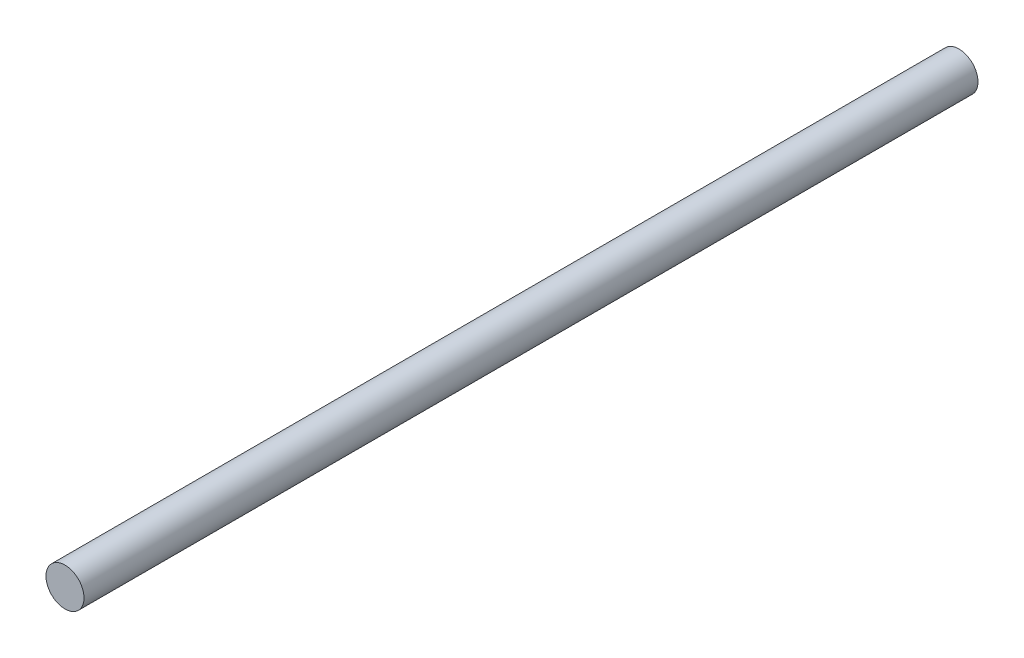
ISO-10303-21;
HEADER;
FILE_DESCRIPTION(('STEP AP214'),'2;1');
FILE_NAME('part.step','',(''),(''),'','','');
FILE_SCHEMA(('AUTOMOTIVE_DESIGN { 1 0 10303 214 1 1 1 1 }'));
ENDSEC;
DATA;
#1=APPLICATION_CONTEXT('core data for automotive mechanical design processes');
#2=APPLICATION_PROTOCOL_DEFINITION('international standard','automotive_design',2000,#1);
#3=PRODUCT_CONTEXT('',#1,'mechanical');
#4=PRODUCT('Part','Part','',(#3));
#5=PRODUCT_RELATED_PRODUCT_CATEGORY('part','',(#4));
#6=PRODUCT_DEFINITION_FORMATION('','',#4);
#7=PRODUCT_DEFINITION_CONTEXT('part definition',#1,'design');
#8=PRODUCT_DEFINITION('design','',#6,#7);
#9=PRODUCT_DEFINITION_SHAPE('','',#8);
#10=(LENGTH_UNIT() NAMED_UNIT(*) SI_UNIT(.MILLI.,.METRE.));
#11=(NAMED_UNIT(*) PLANE_ANGLE_UNIT() SI_UNIT($,.RADIAN.));
#12=(NAMED_UNIT(*) SI_UNIT($,.STERADIAN.) SOLID_ANGLE_UNIT());
#13=UNCERTAINTY_MEASURE_WITH_UNIT(LENGTH_MEASURE(1.E-05),#10,'distance_accuracy_value','');
#14=(GEOMETRIC_REPRESENTATION_CONTEXT(3) GLOBAL_UNCERTAINTY_ASSIGNED_CONTEXT((#13)) GLOBAL_UNIT_ASSIGNED_CONTEXT((#10,
#11,#12)) REPRESENTATION_CONTEXT('',''));
#15=CARTESIAN_POINT('',(0.,0.,0.));
#16=DIRECTION('',(0.,0.,1.));
#17=DIRECTION('',(1.,0.,0.));
#18=AXIS2_PLACEMENT_3D('',#15,#16,#17);
#19=CARTESIAN_POINT('',(-44.5,-44.5,0.));
#20=DIRECTION('',(0.,0.,-1.));
#21=DIRECTION('',(-1.,0.,0.));
#22=AXIS2_PLACEMENT_3D('',#19,#20,#21);
#23=PLANE('',#22);
#24=CARTESIAN_POINT('',(-44.5,-44.5,0.));
#25=DIRECTION('',(0.,0.,1.));
#26=DIRECTION('',(1.,0.,0.));
#27=AXIS2_PLACEMENT_3D('',#24,#25,#26);
#28=CIRCLE('',#27,4.45);
#29=CARTESIAN_POINT('',(-40.05,-44.5,0.));
#30=VERTEX_POINT('',#29);
#31=EDGE_CURVE('E18',#30,#30,#28,.F.);
#32=ORIENTED_EDGE('',*,*,#31,.F.);
#33=EDGE_LOOP('',(#32));
#34=FACE_BOUND('',#33,.T.);
#35=ADVANCED_FACE('F15',(#34),#23,.F.);
#36=CARTESIAN_POINT('',(-44.5,-44.5,-209.));
#37=DIRECTION('',(0.,0.,-1.));
#38=DIRECTION('',(-1.,0.,0.));
#39=AXIS2_PLACEMENT_3D('',#36,#37,#38);
#40=PLANE('',#39);
#41=CARTESIAN_POINT('',(-44.5,-44.5,-209.));
#42=DIRECTION('',(0.,0.,1.));
#43=DIRECTION('',(1.,0.,0.));
#44=AXIS2_PLACEMENT_3D('',#41,#42,#43);
#45=CIRCLE('',#44,4.45);
#46=CARTESIAN_POINT('',(-40.05,-44.5,-209.));
#47=VERTEX_POINT('',#46);
#48=EDGE_CURVE('E10',#47,#47,#45,.T.);
#49=ORIENTED_EDGE('',*,*,#48,.F.);
#50=EDGE_LOOP('',(#49));
#51=FACE_BOUND('',#50,.T.);
#52=ADVANCED_FACE('F30',(#51),#40,.T.);
#53=CARTESIAN_POINT('',(-44.5,-44.5,0.));
#54=DIRECTION('',(0.,0.,1.));
#55=DIRECTION('',(1.,0.,0.));
#56=AXIS2_PLACEMENT_3D('',#53,#54,#55);
#57=CYLINDRICAL_SURFACE('',#56,4.45);
#58=ORIENTED_EDGE('',*,*,#31,.T.);
#59=EDGE_LOOP('',(#58));
#60=FACE_BOUND('',#59,.T.);
#61=ORIENTED_EDGE('',*,*,#48,.T.);
#62=EDGE_LOOP('',(#61));
#63=FACE_BOUND('',#62,.T.);
#64=ADVANCED_FACE('F27',(#60,#63),#57,.T.);
#65=CLOSED_SHELL('',(#35,#52,#64));
#66=MANIFOLD_SOLID_BREP('B1',#65);
#67=ADVANCED_BREP_SHAPE_REPRESENTATION('',(#18,#66),#14);
#68=SHAPE_DEFINITION_REPRESENTATION(#9,#67);
ENDSEC;
END-ISO-10303-21;
